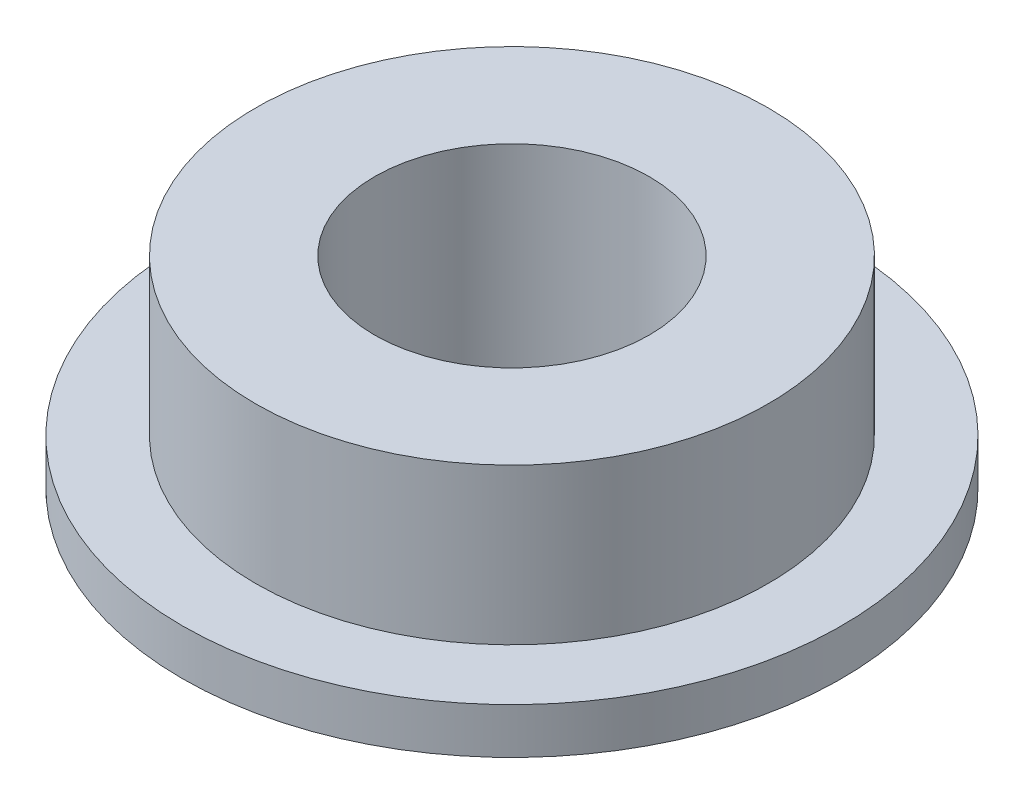
ISO-10303-21;
HEADER;
FILE_DESCRIPTION(('STEP AP214'),'2;1');
FILE_NAME('part.step','',(''),(''),'','','');
FILE_SCHEMA(('AUTOMOTIVE_DESIGN { 1 0 10303 214 1 1 1 1 }'));
ENDSEC;
DATA;
#1=APPLICATION_CONTEXT('core data for automotive mechanical design processes');
#2=APPLICATION_PROTOCOL_DEFINITION('international standard','automotive_design',2000,#1);
#3=PRODUCT_CONTEXT('',#1,'mechanical');
#4=PRODUCT('Part','Part','',(#3));
#5=PRODUCT_RELATED_PRODUCT_CATEGORY('part','',(#4));
#6=PRODUCT_DEFINITION_FORMATION('','',#4);
#7=PRODUCT_DEFINITION_CONTEXT('part definition',#1,'design');
#8=PRODUCT_DEFINITION('design','',#6,#7);
#9=PRODUCT_DEFINITION_SHAPE('','',#8);
#10=(LENGTH_UNIT() NAMED_UNIT(*) SI_UNIT(.MILLI.,.METRE.));
#11=(NAMED_UNIT(*) PLANE_ANGLE_UNIT() SI_UNIT($,.RADIAN.));
#12=(NAMED_UNIT(*) SI_UNIT($,.STERADIAN.) SOLID_ANGLE_UNIT());
#13=UNCERTAINTY_MEASURE_WITH_UNIT(LENGTH_MEASURE(1.E-05),#10,'distance_accuracy_value','');
#14=(GEOMETRIC_REPRESENTATION_CONTEXT(3) GLOBAL_UNCERTAINTY_ASSIGNED_CONTEXT((#13)) GLOBAL_UNIT_ASSIGNED_CONTEXT((#10,
#11,#12)) REPRESENTATION_CONTEXT('',''));
#15=CARTESIAN_POINT('',(0.,0.,0.));
#16=DIRECTION('',(0.,0.,1.));
#17=DIRECTION('',(1.,0.,0.));
#18=AXIS2_PLACEMENT_3D('',#15,#16,#17);
#19=CARTESIAN_POINT('',(0.,2.5,0.));
#20=DIRECTION('',(0.,1.,0.));
#21=DIRECTION('',(0.,0.,1.));
#22=AXIS2_PLACEMENT_3D('',#19,#20,#21);
#23=PLANE('',#22);
#24=CARTESIAN_POINT('',(0.,2.5,0.));
#25=DIRECTION('',(0.,1.,0.));
#26=DIRECTION('',(0.,0.,1.));
#27=AXIS2_PLACEMENT_3D('',#24,#25,#26);
#28=CIRCLE('',#27,14.);
#29=CARTESIAN_POINT('',(0.,2.5,14.));
#30=VERTEX_POINT('',#29);
#31=EDGE_CURVE('E10',#30,#30,#28,.T.);
#32=ORIENTED_EDGE('',*,*,#31,.F.);
#33=EDGE_LOOP('',(#32));
#34=FACE_BOUND('',#33,.T.);
#35=CARTESIAN_POINT('',(0.,2.5,0.));
#36=DIRECTION('',(0.,1.,0.));
#37=DIRECTION('',(0.,0.,1.));
#38=AXIS2_PLACEMENT_3D('',#35,#36,#37);
#39=CIRCLE('',#38,18.);
#40=CARTESIAN_POINT('',(0.,2.5,18.));
#41=VERTEX_POINT('',#40);
#42=EDGE_CURVE('E46',#41,#41,#39,.T.);
#43=ORIENTED_EDGE('',*,*,#42,.T.);
#44=EDGE_LOOP('',(#43));
#45=FACE_BOUND('',#44,.T.);
#46=ADVANCED_FACE('F37',(#34,#45),#23,.T.);
#47=CARTESIAN_POINT('',(0.,0.,0.));
#48=DIRECTION('',(0.,1.,0.));
#49=DIRECTION('',(0.,0.,1.));
#50=AXIS2_PLACEMENT_3D('',#47,#48,#49);
#51=PLANE('',#50);
#52=CARTESIAN_POINT('',(0.,0.,0.));
#53=DIRECTION('',(0.,1.,0.));
#54=DIRECTION('',(0.,0.,1.));
#55=AXIS2_PLACEMENT_3D('',#52,#53,#54);
#56=CIRCLE('',#55,18.);
#57=CARTESIAN_POINT('',(0.,0.,18.));
#58=VERTEX_POINT('',#57);
#59=EDGE_CURVE('E41',#58,#58,#56,.T.);
#60=ORIENTED_EDGE('',*,*,#59,.F.);
#61=EDGE_LOOP('',(#60));
#62=FACE_BOUND('',#61,.T.);
#63=CARTESIAN_POINT('',(0.,0.,0.));
#64=DIRECTION('',(0.,1.,0.));
#65=DIRECTION('',(0.,0.,1.));
#66=AXIS2_PLACEMENT_3D('',#63,#64,#65);
#67=CIRCLE('',#66,7.5);
#68=CARTESIAN_POINT('',(0.,0.,7.5));
#69=VERTEX_POINT('',#68);
#70=EDGE_CURVE('E56',#69,#69,#67,.T.);
#71=ORIENTED_EDGE('',*,*,#70,.T.);
#72=EDGE_LOOP('',(#71));
#73=FACE_BOUND('',#72,.T.);
#74=ADVANCED_FACE('F87',(#62,#73),#51,.F.);
#75=CARTESIAN_POINT('',(0.,2.5,0.));
#76=DIRECTION('',(0.,-1.,0.));
#77=DIRECTION('',(0.,0.,-1.));
#78=AXIS2_PLACEMENT_3D('',#75,#76,#77);
#79=CYLINDRICAL_SURFACE('',#78,18.);
#80=ORIENTED_EDGE('',*,*,#42,.F.);
#81=EDGE_LOOP('',(#80));
#82=FACE_BOUND('',#81,.T.);
#83=ORIENTED_EDGE('',*,*,#59,.T.);
#84=EDGE_LOOP('',(#83));
#85=FACE_BOUND('',#84,.T.);
#86=ADVANCED_FACE('F39',(#82,#85),#79,.T.);
#87=CARTESIAN_POINT('',(0.,2.5,0.));
#88=DIRECTION('',(0.,-1.,0.));
#89=DIRECTION('',(0.,0.,-1.));
#90=AXIS2_PLACEMENT_3D('',#87,#88,#89);
#91=CYLINDRICAL_SURFACE('',#90,7.5);
#92=ORIENTED_EDGE('',*,*,#70,.F.);
#93=EDGE_LOOP('',(#92));
#94=FACE_BOUND('',#93,.T.);
#95=CARTESIAN_POINT('',(0.,11.,0.));
#96=DIRECTION('',(0.,1.,0.));
#97=DIRECTION('',(0.,0.,1.));
#98=AXIS2_PLACEMENT_3D('',#95,#96,#97);
#99=CIRCLE('',#98,7.5);
#100=CARTESIAN_POINT('',(0.,11.,7.5));
#101=VERTEX_POINT('',#100);
#102=EDGE_CURVE('E65',#101,#101,#99,.T.);
#103=ORIENTED_EDGE('',*,*,#102,.T.);
#104=EDGE_LOOP('',(#103));
#105=FACE_BOUND('',#104,.T.);
#106=ADVANCED_FACE('F72',(#94,#105),#91,.F.);
#107=CARTESIAN_POINT('',(0.,11.,0.));
#108=DIRECTION('',(0.,1.,0.));
#109=DIRECTION('',(0.,0.,1.));
#110=AXIS2_PLACEMENT_3D('',#107,#108,#109);
#111=PLANE('',#110);
#112=CARTESIAN_POINT('',(0.,11.,0.));
#113=DIRECTION('',(0.,1.,0.));
#114=DIRECTION('',(0.,0.,1.));
#115=AXIS2_PLACEMENT_3D('',#112,#113,#114);
#116=CIRCLE('',#115,14.);
#117=CARTESIAN_POINT('',(0.,11.,14.));
#118=VERTEX_POINT('',#117);
#119=EDGE_CURVE('E54',#118,#118,#116,.T.);
#120=ORIENTED_EDGE('',*,*,#119,.T.);
#121=EDGE_LOOP('',(#120));
#122=FACE_BOUND('',#121,.T.);
#123=ORIENTED_EDGE('',*,*,#102,.F.);
#124=EDGE_LOOP('',(#123));
#125=FACE_BOUND('',#124,.T.);
#126=ADVANCED_FACE('F74',(#122,#125),#111,.T.);
#127=CARTESIAN_POINT('',(0.,11.,0.));
#128=DIRECTION('',(0.,-1.,0.));
#129=DIRECTION('',(0.,0.,-1.));
#130=AXIS2_PLACEMENT_3D('',#127,#128,#129);
#131=CYLINDRICAL_SURFACE('',#130,14.);
#132=ORIENTED_EDGE('',*,*,#119,.F.);
#133=EDGE_LOOP('',(#132));
#134=FACE_BOUND('',#133,.T.);
#135=ORIENTED_EDGE('',*,*,#31,.T.);
#136=EDGE_LOOP('',(#135));
#137=FACE_BOUND('',#136,.T.);
#138=ADVANCED_FACE('F76',(#134,#137),#131,.T.);
#139=CLOSED_SHELL('',(#46,#74,#86,#106,#126,#138));
#140=MANIFOLD_SOLID_BREP('B2',#139);
#141=ADVANCED_BREP_SHAPE_REPRESENTATION('',(#18,#140),#14);
#142=SHAPE_DEFINITION_REPRESENTATION(#9,#141);
ENDSEC;
END-ISO-10303-21;
